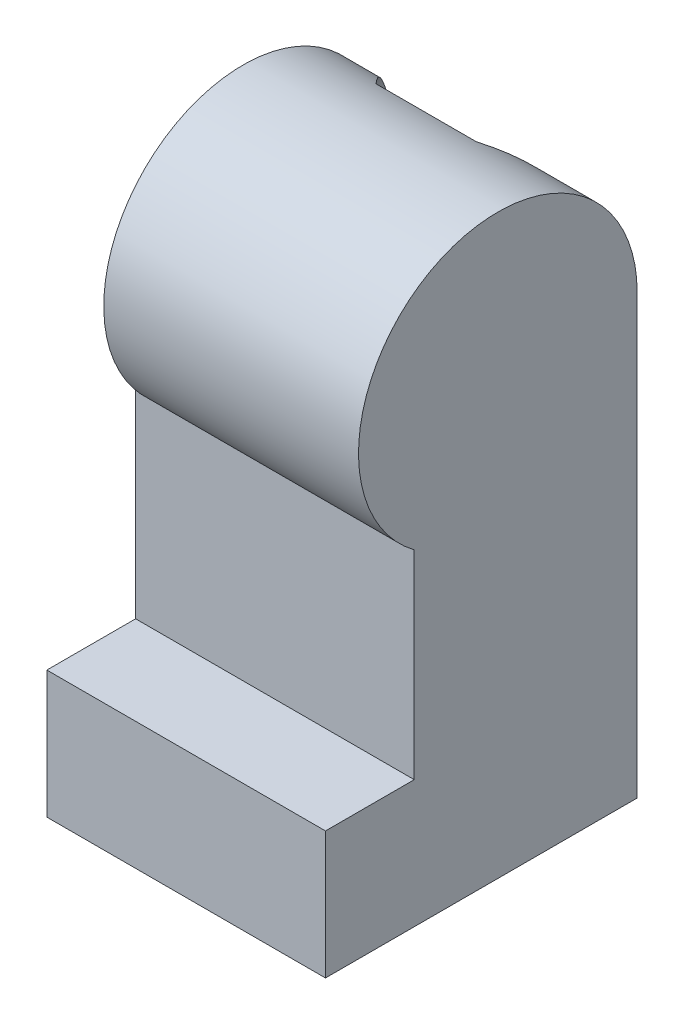
ISO-10303-21;
HEADER;
FILE_DESCRIPTION(('STEP AP214'),'2;1');
FILE_NAME('part.step','',(''),(''),'','','');
FILE_SCHEMA(('AUTOMOTIVE_DESIGN { 1 0 10303 214 1 1 1 1 }'));
ENDSEC;
DATA;
#1=APPLICATION_CONTEXT('core data for automotive mechanical design processes');
#2=APPLICATION_PROTOCOL_DEFINITION('international standard','automotive_design',2000,#1);
#3=PRODUCT_CONTEXT('',#1,'mechanical');
#4=PRODUCT('Part','Part','',(#3));
#5=PRODUCT_RELATED_PRODUCT_CATEGORY('part','',(#4));
#6=PRODUCT_DEFINITION_FORMATION('','',#4);
#7=PRODUCT_DEFINITION_CONTEXT('part definition',#1,'design');
#8=PRODUCT_DEFINITION('design','',#6,#7);
#9=PRODUCT_DEFINITION_SHAPE('','',#8);
#10=(LENGTH_UNIT() NAMED_UNIT(*) SI_UNIT(.MILLI.,.METRE.));
#11=(NAMED_UNIT(*) PLANE_ANGLE_UNIT() SI_UNIT($,.RADIAN.));
#12=(NAMED_UNIT(*) SI_UNIT($,.STERADIAN.) SOLID_ANGLE_UNIT());
#13=UNCERTAINTY_MEASURE_WITH_UNIT(LENGTH_MEASURE(1.E-05),#10,'distance_accuracy_value','');
#14=(GEOMETRIC_REPRESENTATION_CONTEXT(3) GLOBAL_UNCERTAINTY_ASSIGNED_CONTEXT((#13)) GLOBAL_UNIT_ASSIGNED_CONTEXT((#10,
#11,#12)) REPRESENTATION_CONTEXT('',''));
#15=CARTESIAN_POINT('',(0.,0.,0.));
#16=DIRECTION('',(0.,0.,1.));
#17=DIRECTION('',(1.,0.,0.));
#18=AXIS2_PLACEMENT_3D('',#15,#16,#17);
#19=CARTESIAN_POINT('',(10.5,11.9,-6.03));
#20=DIRECTION('',(0.,0.,-1.));
#21=DIRECTION('',(1.,0.,0.));
#22=AXIS2_PLACEMENT_3D('',#19,#20,#21);
#23=PLANE('',#22);
#24=DIRECTION('',(0.,1.,0.));
#25=VECTOR('',#24,1.);
#26=CARTESIAN_POINT('',(12.659602312779,13.1594117081557,-6.03));
#27=LINE('',#26,#25);
#28=CARTESIAN_POINT('',(12.659602312779,10.6405882918443,-6.03));
#29=VERTEX_POINT('',#28);
#30=CARTESIAN_POINT('',(12.659602312779,13.1594117081557,-6.03));
#31=VERTEX_POINT('',#30);
#32=EDGE_CURVE('E187',#29,#31,#27,.T.);
#33=ORIENTED_EDGE('',*,*,#32,.T.);
#34=CARTESIAN_POINT('',(10.5,11.9,-6.03));
#35=DIRECTION('',(0.,0.,1.));
#36=DIRECTION('',(1.,0.,0.));
#37=AXIS2_PLACEMENT_3D('',#34,#35,#36);
#38=CIRCLE('',#37,2.5);
#39=EDGE_CURVE('E267',#29,#31,#38,.T.);
#40=ORIENTED_EDGE('',*,*,#39,.F.);
#41=EDGE_LOOP('',(#33,#40));
#42=FACE_BOUND('',#41,.T.);
#43=ADVANCED_FACE('F39',(#42),#23,.T.);
#44=CARTESIAN_POINT('',(7.,11.,-4.33));
#45=DIRECTION('',(1.,0.,0.));
#46=DIRECTION('',(0.,0.,1.));
#47=AXIS2_PLACEMENT_3D('',#44,#45,#46);
#48=CYLINDRICAL_SURFACE('',#47,3.5);
#49=DIRECTION('',(1.,0.,0.));
#50=VECTOR('',#49,1.);
#51=CARTESIAN_POINT('',(7.,11.,-7.83));
#52=LINE('',#51,#50);
#53=CARTESIAN_POINT('',(7.6,11.,-7.83));
#54=VERTEX_POINT('',#53);
#55=CARTESIAN_POINT('',(8.16761924206188,11.,-7.83));
#56=VERTEX_POINT('',#55);
#57=EDGE_CURVE('E399',#54,#56,#52,.T.);
#58=ORIENTED_EDGE('',*,*,#57,.F.);
#59=CARTESIAN_POINT('',(7.6,11.,-4.33));
#60=DIRECTION('',(1.,0.,0.));
#61=DIRECTION('',(0.,0.,-1.));
#62=AXIS2_PLACEMENT_3D('',#59,#60,#61);
#63=CIRCLE('',#62,3.5);
#64=CARTESIAN_POINT('',(7.6,8.2,-2.23));
#65=VERTEX_POINT('',#64);
#66=EDGE_CURVE('E446',#54,#65,#63,.T.);
#67=ORIENTED_EDGE('',*,*,#66,.T.);
#68=DIRECTION('',(1.,0.,0.));
#69=VECTOR('',#68,1.);
#70=CARTESIAN_POINT('',(7.,8.2,-2.23));
#71=LINE('',#70,#69);
#72=CARTESIAN_POINT('',(14.,8.2,-2.23));
#73=VERTEX_POINT('',#72);
#74=EDGE_CURVE('E409',#65,#73,#71,.T.);
#75=ORIENTED_EDGE('',*,*,#74,.T.);
#76=CARTESIAN_POINT('',(14.,11.,-4.33));
#77=DIRECTION('',(1.,0.,0.));
#78=DIRECTION('',(0.,0.,1.));
#79=AXIS2_PLACEMENT_3D('',#76,#77,#78);
#80=CIRCLE('',#79,3.5);
#81=CARTESIAN_POINT('',(14.,11.,-7.83));
#82=VERTEX_POINT('',#81);
#83=EDGE_CURVE('E405',#82,#73,#80,.T.);
#84=ORIENTED_EDGE('',*,*,#83,.F.);
#85=CARTESIAN_POINT('',(12.8323807579381,11.,-7.83));
#86=VERTEX_POINT('',#85);
#87=EDGE_CURVE('E392',#86,#82,#52,.T.);
#88=ORIENTED_EDGE('',*,*,#87,.F.);
#89=CARTESIAN_POINT('',(11.7597384945616,14.0594117081557,-6.03));
#90=CARTESIAN_POINT('',(11.8269170363958,14.0201847934842,-6.10060872018845));
#91=CARTESIAN_POINT('',(11.8924138425216,13.9778062067549,-6.17110437893786));
#92=CARTESIAN_POINT('',(12.0199070438475,13.886475673501,-6.31122449351207));
#93=CARTESIAN_POINT('',(12.0818980752608,13.8375140219315,-6.38084749392807));
#94=CARTESIAN_POINT('',(12.2026603057797,13.7323237192715,-6.51907095077589));
#95=CARTESIAN_POINT('',(12.2613917290616,13.6760253638337,-6.58765346961922));
#96=CARTESIAN_POINT('',(12.3743275687795,13.5564001910063,-6.72226296218016));
#97=CARTESIAN_POINT('',(12.4285347644146,13.4930777449861,-6.78829149121666));
#98=CARTESIAN_POINT('',(12.5579800485929,13.3251253424091,-6.9498129946883));
#99=CARTESIAN_POINT('',(12.629913797011,13.215851810845,-7.0432353067989));
#100=CARTESIAN_POINT('',(12.7581230005923,12.9810490235027,-7.21908778885267));
#101=CARTESIAN_POINT('',(12.8144565088714,12.8555826543195,-7.30155810113673));
#102=CARTESIAN_POINT('',(12.8987130416593,12.6137561391326,-7.43828234742055));
#103=CARTESIAN_POINT('',(12.929946153069,12.49991962628,-7.49493864656214));
#104=CARTESIAN_POINT('',(12.9763091085754,12.263750084517,-7.59640100657131));
#105=CARTESIAN_POINT('',(12.9914393811044,12.1414172817513,-7.64120738269428));
#106=CARTESIAN_POINT('',(13.0002185014562,11.9537837363267,-7.69818210216271));
#107=CARTESIAN_POINT('',(13.0007994518895,11.8902869949017,-7.71551654467827));
#108=CARTESIAN_POINT('',(12.9970348332925,11.7625652319258,-7.74654781322381));
#109=CARTESIAN_POINT('',(12.9926916438571,11.6983405769829,-7.76024639234143));
#110=CARTESIAN_POINT('',(12.9789416670705,11.5698114935737,-7.78392315250354));
#111=CARTESIAN_POINT('',(12.9695394045106,11.5055071875433,-7.79390464460064));
#112=CARTESIAN_POINT('',(12.9456374275569,11.3774122743731,-7.81019020121197));
#113=CARTESIAN_POINT('',(12.9311406114651,11.3136213962056,-7.8164963512245));
#114=CARTESIAN_POINT('',(12.9027218090513,11.2080053885378,-7.82407239011788));
#115=CARTESIAN_POINT('',(12.8901847199492,11.1658691875481,-7.82631710407692));
#116=CARTESIAN_POINT('',(12.8629174636449,11.0823513081066,-7.82928055361981));
#117=CARTESIAN_POINT('',(12.8481917507054,11.0409682844664,-7.83000234432515));
#118=CARTESIAN_POINT('',(12.8323807579381,11.,-7.83));
#119=B_SPLINE_CURVE_WITH_KNOTS('',3,(#89,#90,#91,#92,#93,#94,#95,#96,#97,#98,#99,#100,#101,#102,
#103,#104,#105,#106,#107,#108,#109,#110,#111,#112,#113,#114,#115,#116,#117,#118),.UNSPECIFIED.,
.F.,.F.,(4,2,2,2,2,2,2,2,2,2,2,2,2,2,4),(0.,0.315151563393052,0.630772938407095,
0.949647664416301,1.26832504380493,1.74888218158112,2.2276262284512,2.61891205471195,
3.01018747015603,3.20741415078802,3.40454556206459,3.60150095306902,3.79834447665022,
3.9303197138308,4.06202994406064),.UNSPECIFIED.);
#120=CARTESIAN_POINT('',(11.7597384945616,14.0594117081557,-6.03));
#121=VERTEX_POINT('',#120);
#122=EDGE_CURVE('E264',#121,#86,#119,.T.);
#123=ORIENTED_EDGE('',*,*,#122,.F.);
#124=DIRECTION('',(1.,0.,0.));
#125=VECTOR('',#124,1.);
#126=CARTESIAN_POINT('',(7.,14.0594117081557,-6.03));
#127=LINE('',#126,#125);
#128=CARTESIAN_POINT('',(9.24026150543844,14.0594117081557,-6.03));
#129=VERTEX_POINT('',#128);
#130=EDGE_CURVE('E47',#121,#129,#127,.F.);
#131=ORIENTED_EDGE('',*,*,#130,.T.);
#132=CARTESIAN_POINT('',(8.16761924206188,11.,-7.83));
#133=CARTESIAN_POINT('',(8.14615177989283,11.0556037228795,-7.83001039992839));
#134=CARTESIAN_POINT('',(8.12669136325152,11.1119864470982,-7.82867511545479));
#135=CARTESIAN_POINT('',(8.09187280917411,11.2258673812913,-7.82316690174125));
#136=CARTESIAN_POINT('',(8.0765146266199,11.2833655789899,-7.81899400371236));
#137=CARTESIAN_POINT('',(8.05004337555136,11.398795817994,-7.80768783715019));
#138=CARTESIAN_POINT('',(8.03891292930839,11.4567250630494,-7.80056694421528));
#139=CARTESIAN_POINT('',(8.02081235353894,11.5727648991559,-7.78331566720582));
#140=CARTESIAN_POINT('',(8.01384194622392,11.6308754778378,-7.77318548414569));
#141=CARTESIAN_POINT('',(7.99910835882942,11.8048723986325,-7.73824257253206));
#142=CARTESIAN_POINT('',(7.99751647081468,11.9204521126609,-7.70887479252964));
#143=CARTESIAN_POINT('',(8.00965198142615,12.1471916349346,-7.63878917767626));
#144=CARTESIAN_POINT('',(8.02338624827262,12.2583494384298,-7.59806626030262));
#145=CARTESIAN_POINT('',(8.06486402925899,12.4769175354432,-7.50540527907961));
#146=CARTESIAN_POINT('',(8.09299494351911,12.5841312762403,-7.45318113676706));
#147=CARTESIAN_POINT('',(8.16118714895019,12.7897849945176,-7.34006344052072));
#148=CARTESIAN_POINT('',(8.20125622019924,12.8882191958614,-7.2791642466183));
#149=CARTESIAN_POINT('',(8.31511676823279,13.1254072001919,-7.11620266989741));
#150=CARTESIAN_POINT('',(8.39551340098805,13.2577904960523,-7.00946321174239));
#151=CARTESIAN_POINT('',(8.57329011604992,13.5001573524239,-6.78492408509301));
#152=CARTESIAN_POINT('',(8.67071979837661,13.6100734029028,-6.66709259247695));
#153=CARTESIAN_POINT('',(8.84668508222913,13.7778882147941,-6.46193011620579));
#154=CARTESIAN_POINT('',(8.92190568254684,13.8414219972976,-6.3762723496963));
#155=CARTESIAN_POINT('',(9.03859410206556,13.9289491749926,-6.24675438405102));
#156=CARTESIAN_POINT('',(9.07798877112856,13.9567455338021,-6.20356263672901));
#157=CARTESIAN_POINT('',(9.15812093316136,14.0098970517849,-6.11692589064731));
#158=CARTESIAN_POINT('',(9.19885838282646,14.0352522895812,-6.07348090009182));
#159=CARTESIAN_POINT('',(9.24026150543844,14.0594117081557,-6.03));
#160=B_SPLINE_CURVE_WITH_KNOTS('',3,(#132,#133,#134,#135,#136,#137,#138,#139,#140,#141,#142,
#143,#144,#145,#146,#147,#148,#149,#150,#151,#152,#153,#154,#155,#156,#157,#158,#159),
.UNSPECIFIED.,.F.,.F.,(4,2,2,2,2,2,2,2,2,2,2,2,2,4),(0.,0.178763199102519,0.357524432010829,
0.535542719933675,0.71354911927172,1.06947602744379,1.42556250378531,1.79177839089952,
2.15823346432115,2.71942223368447,3.28227325770834,3.6732563436139,3.867394978456,
4.06152735843827),.UNSPECIFIED.);
#161=EDGE_CURVE('E278',#56,#129,#160,.T.);
#162=ORIENTED_EDGE('',*,*,#161,.F.);
#163=EDGE_LOOP('',(#58,#67,#75,#84,#88,#123,#131,#162));
#164=FACE_BOUND('',#163,.T.);
#165=ADVANCED_FACE('F288',(#164),#48,.T.);
#166=CARTESIAN_POINT('',(7.,3.2,0.));
#167=DIRECTION('',(0.,0.,-1.));
#168=DIRECTION('',(0.,1.,0.));
#169=AXIS2_PLACEMENT_3D('',#166,#167,#168);
#170=PLANE('',#169);
#171=DIRECTION('',(0.,-1.,0.));
#172=VECTOR('',#171,1.);
#173=CARTESIAN_POINT('',(14.,3.2,0.));
#174=LINE('',#173,#172);
#175=CARTESIAN_POINT('',(14.,3.2,0.));
#176=VERTEX_POINT('',#175);
#177=CARTESIAN_POINT('',(14.,0.,0.));
#178=VERTEX_POINT('',#177);
#179=EDGE_CURVE('E449',#176,#178,#174,.T.);
#180=ORIENTED_EDGE('',*,*,#179,.F.);
#181=DIRECTION('',(1.,0.,0.));
#182=VECTOR('',#181,1.);
#183=CARTESIAN_POINT('',(7.,3.2,0.));
#184=LINE('',#183,#182);
#185=CARTESIAN_POINT('',(7.,3.2,0.));
#186=VERTEX_POINT('',#185);
#187=EDGE_CURVE('E422',#186,#176,#184,.T.);
#188=ORIENTED_EDGE('',*,*,#187,.F.);
#189=DIRECTION('',(0.,-1.,0.));
#190=VECTOR('',#189,1.);
#191=CARTESIAN_POINT('',(7.,3.2,0.));
#192=LINE('',#191,#190);
#193=CARTESIAN_POINT('',(7.,0.,0.));
#194=VERTEX_POINT('',#193);
#195=EDGE_CURVE('E421',#186,#194,#192,.T.);
#196=ORIENTED_EDGE('',*,*,#195,.T.);
#197=DIRECTION('',(1.,0.,0.));
#198=VECTOR('',#197,1.);
#199=CARTESIAN_POINT('',(7.,0.,0.));
#200=LINE('',#199,#198);
#201=EDGE_CURVE('E434',#194,#178,#200,.T.);
#202=ORIENTED_EDGE('',*,*,#201,.T.);
#203=EDGE_LOOP('',(#180,#188,#196,#202));
#204=FACE_BOUND('',#203,.T.);
#205=ADVANCED_FACE('F41',(#204),#170,.F.);
#206=CARTESIAN_POINT('',(7.,0.,0.));
#207=DIRECTION('',(0.,1.,0.));
#208=DIRECTION('',(0.,0.,1.));
#209=AXIS2_PLACEMENT_3D('',#206,#207,#208);
#210=PLANE('',#209);
#211=DIRECTION('',(-1.,0.,0.));
#212=VECTOR('',#211,1.);
#213=CARTESIAN_POINT('',(8.,0.,-6.4));
#214=LINE('',#213,#212);
#215=CARTESIAN_POINT('',(13.,0.,-6.4));
#216=VERTEX_POINT('',#215);
#217=CARTESIAN_POINT('',(8.,0.,-6.4));
#218=VERTEX_POINT('',#217);
#219=EDGE_CURVE('E245',#216,#218,#214,.T.);
#220=ORIENTED_EDGE('',*,*,#219,.T.);
#221=DIRECTION('',(0.,0.,1.));
#222=VECTOR('',#221,1.);
#223=CARTESIAN_POINT('',(8.,0.,-1.4));
#224=LINE('',#223,#222);
#225=CARTESIAN_POINT('',(8.,0.,-1.4));
#226=VERTEX_POINT('',#225);
#227=EDGE_CURVE('E248',#218,#226,#224,.T.);
#228=ORIENTED_EDGE('',*,*,#227,.T.);
#229=DIRECTION('',(1.,0.,0.));
#230=VECTOR('',#229,1.);
#231=CARTESIAN_POINT('',(13.,0.,-1.4));
#232=LINE('',#231,#230);
#233=CARTESIAN_POINT('',(13.,0.,-1.4));
#234=VERTEX_POINT('',#233);
#235=EDGE_CURVE('E238',#226,#234,#232,.T.);
#236=ORIENTED_EDGE('',*,*,#235,.T.);
#237=DIRECTION('',(0.,0.,-1.));
#238=VECTOR('',#237,1.);
#239=CARTESIAN_POINT('',(13.,0.,-6.4));
#240=LINE('',#239,#238);
#241=EDGE_CURVE('E233',#234,#216,#240,.T.);
#242=ORIENTED_EDGE('',*,*,#241,.T.);
#243=EDGE_LOOP('',(#220,#228,#236,#242));
#244=FACE_BOUND('',#243,.T.);
#245=DIRECTION('',(0.,0.,-1.));
#246=VECTOR('',#245,1.);
#247=CARTESIAN_POINT('',(14.,0.,0.));
#248=LINE('',#247,#246);
#249=CARTESIAN_POINT('',(14.,0.,-7.83));
#250=VERTEX_POINT('',#249);
#251=EDGE_CURVE('E416',#178,#250,#248,.T.);
#252=ORIENTED_EDGE('',*,*,#251,.F.);
#253=ORIENTED_EDGE('',*,*,#201,.F.);
#254=DIRECTION('',(0.,0.,-1.));
#255=VECTOR('',#254,1.);
#256=CARTESIAN_POINT('',(7.,0.,0.));
#257=LINE('',#256,#255);
#258=CARTESIAN_POINT('',(7.,0.,-7.83));
#259=VERTEX_POINT('',#258);
#260=EDGE_CURVE('E452',#194,#259,#257,.T.);
#261=ORIENTED_EDGE('',*,*,#260,.T.);
#262=DIRECTION('',(1.,0.,0.));
#263=VECTOR('',#262,1.);
#264=CARTESIAN_POINT('',(7.,0.,-7.83));
#265=LINE('',#264,#263);
#266=EDGE_CURVE('E432',#259,#250,#265,.T.);
#267=ORIENTED_EDGE('',*,*,#266,.T.);
#268=EDGE_LOOP('',(#252,#253,#261,#267));
#269=FACE_BOUND('',#268,.T.);
#270=ADVANCED_FACE('F299',(#244,#269),#210,.F.);
#271=CARTESIAN_POINT('',(7.,0.,-7.83));
#272=DIRECTION('',(0.,0.,1.));
#273=DIRECTION('',(-1.,0.,0.));
#274=AXIS2_PLACEMENT_3D('',#271,#272,#273);
#275=PLANE('',#274);
#276=CARTESIAN_POINT('',(10.5,3.9,-7.83));
#277=DIRECTION('',(0.,0.,1.));
#278=DIRECTION('',(1.,0.,0.));
#279=AXIS2_PLACEMENT_3D('',#276,#277,#278);
#280=CIRCLE('',#279,2.5);
#281=CARTESIAN_POINT('',(13.,3.9,-7.83));
#282=VERTEX_POINT('',#281);
#283=EDGE_CURVE('E261',#282,#282,#280,.T.);
#284=ORIENTED_EDGE('',*,*,#283,.T.);
#285=EDGE_LOOP('',(#284));
#286=FACE_BOUND('',#285,.T.);
#287=ORIENTED_EDGE('',*,*,#87,.T.);
#288=DIRECTION('',(0.,1.,0.));
#289=VECTOR('',#288,1.);
#290=CARTESIAN_POINT('',(14.,0.,-7.83));
#291=LINE('',#290,#289);
#292=EDGE_CURVE('E395',#250,#82,#291,.T.);
#293=ORIENTED_EDGE('',*,*,#292,.F.);
#294=ORIENTED_EDGE('',*,*,#266,.F.);
#295=DIRECTION('',(0.,1.,0.));
#296=VECTOR('',#295,1.);
#297=CARTESIAN_POINT('',(7.,0.,-7.83));
#298=LINE('',#297,#296);
#299=CARTESIAN_POINT('',(7.,11.,-7.83));
#300=VERTEX_POINT('',#299);
#301=EDGE_CURVE('E455',#259,#300,#298,.T.);
#302=ORIENTED_EDGE('',*,*,#301,.T.);
#303=EDGE_CURVE('E402',#300,#54,#52,.T.);
#304=ORIENTED_EDGE('',*,*,#303,.T.);
#305=ORIENTED_EDGE('',*,*,#57,.T.);
#306=CARTESIAN_POINT('',(10.5,11.9,-7.83));
#307=DIRECTION('',(0.,0.,1.));
#308=DIRECTION('',(1.,0.,0.));
#309=AXIS2_PLACEMENT_3D('',#306,#307,#308);
#310=CIRCLE('',#309,2.5);
#311=EDGE_CURVE('E255',#56,#86,#310,.T.);
#312=ORIENTED_EDGE('',*,*,#311,.T.);
#313=EDGE_LOOP('',(#287,#293,#294,#302,#304,#305,#312));
#314=FACE_BOUND('',#313,.T.);
#315=ADVANCED_FACE('F296',(#286,#314),#275,.F.);
#316=CARTESIAN_POINT('',(7.,3.2,-2.23));
#317=DIRECTION('',(0.,0.,-1.));
#318=DIRECTION('',(1.,0.,0.));
#319=AXIS2_PLACEMENT_3D('',#316,#317,#318);
#320=PLANE('',#319);
#321=DIRECTION('',(0.,-1.,0.));
#322=VECTOR('',#321,1.);
#323=CARTESIAN_POINT('',(14.,3.2,-2.23));
#324=LINE('',#323,#322);
#325=CARTESIAN_POINT('',(14.,3.2,-2.23));
#326=VERTEX_POINT('',#325);
#327=EDGE_CURVE('E412',#73,#326,#324,.T.);
#328=ORIENTED_EDGE('',*,*,#327,.F.);
#329=ORIENTED_EDGE('',*,*,#74,.F.);
#330=CARTESIAN_POINT('',(7.,8.2,-2.23));
#331=VERTEX_POINT('',#330);
#332=EDGE_CURVE('E400',#331,#65,#71,.T.);
#333=ORIENTED_EDGE('',*,*,#332,.F.);
#334=DIRECTION('',(0.,-1.,0.));
#335=VECTOR('',#334,1.);
#336=CARTESIAN_POINT('',(7.,3.2,-2.23));
#337=LINE('',#336,#335);
#338=CARTESIAN_POINT('',(7.,3.2,-2.23));
#339=VERTEX_POINT('',#338);
#340=EDGE_CURVE('E458',#331,#339,#337,.T.);
#341=ORIENTED_EDGE('',*,*,#340,.T.);
#342=DIRECTION('',(1.,0.,0.));
#343=VECTOR('',#342,1.);
#344=CARTESIAN_POINT('',(7.,3.2,-2.23));
#345=LINE('',#344,#343);
#346=EDGE_CURVE('E425',#339,#326,#345,.T.);
#347=ORIENTED_EDGE('',*,*,#346,.T.);
#348=EDGE_LOOP('',(#328,#329,#333,#341,#347));
#349=FACE_BOUND('',#348,.T.);
#350=ADVANCED_FACE('F294',(#349),#320,.F.);
#351=CARTESIAN_POINT('',(7.,3.2,-2.23));
#352=DIRECTION('',(0.,-1.,0.));
#353=DIRECTION('',(0.,0.,-1.));
#354=AXIS2_PLACEMENT_3D('',#351,#352,#353);
#355=PLANE('',#354);
#356=DIRECTION('',(0.,0.,1.));
#357=VECTOR('',#356,1.);
#358=CARTESIAN_POINT('',(14.,3.2,-2.23));
#359=LINE('',#358,#357);
#360=EDGE_CURVE('E414',#326,#176,#359,.T.);
#361=ORIENTED_EDGE('',*,*,#360,.F.);
#362=ORIENTED_EDGE('',*,*,#346,.F.);
#363=DIRECTION('',(0.,0.,1.));
#364=VECTOR('',#363,1.);
#365=CARTESIAN_POINT('',(7.,3.2,-2.23));
#366=LINE('',#365,#364);
#367=EDGE_CURVE('E426',#339,#186,#366,.T.);
#368=ORIENTED_EDGE('',*,*,#367,.T.);
#369=ORIENTED_EDGE('',*,*,#187,.T.);
#370=EDGE_LOOP('',(#361,#362,#368,#369));
#371=FACE_BOUND('',#370,.T.);
#372=ADVANCED_FACE('F481',(#371),#355,.F.);
#373=CARTESIAN_POINT('',(7.,11.,-4.33));
#374=DIRECTION('',(1.,0.,0.));
#375=DIRECTION('',(0.,0.,1.));
#376=AXIS2_PLACEMENT_3D('',#373,#374,#375);
#377=PLANE('',#376);
#378=ORIENTED_EDGE('',*,*,#301,.F.);
#379=ORIENTED_EDGE('',*,*,#260,.F.);
#380=ORIENTED_EDGE('',*,*,#195,.F.);
#381=ORIENTED_EDGE('',*,*,#367,.F.);
#382=ORIENTED_EDGE('',*,*,#340,.F.);
#383=CARTESIAN_POINT('',(7.,11.,-4.33));
#384=DIRECTION('',(-1.,0.,0.));
#385=DIRECTION('',(0.,0.,1.));
#386=AXIS2_PLACEMENT_3D('',#383,#384,#385);
#387=CIRCLE('',#386,3.5);
#388=EDGE_CURVE('E437',#300,#331,#387,.T.);
#389=ORIENTED_EDGE('',*,*,#388,.F.);
#390=EDGE_LOOP('',(#378,#379,#380,#381,#382,#389));
#391=FACE_BOUND('',#390,.T.);
#392=ADVANCED_FACE('F470',(#391),#377,.F.);
#393=CARTESIAN_POINT('',(14.,11.,-4.33));
#394=DIRECTION('',(1.,0.,0.));
#395=DIRECTION('',(0.,0.,1.));
#396=AXIS2_PLACEMENT_3D('',#393,#394,#395);
#397=PLANE('',#396);
#398=ORIENTED_EDGE('',*,*,#179,.T.);
#399=ORIENTED_EDGE('',*,*,#251,.T.);
#400=ORIENTED_EDGE('',*,*,#292,.T.);
#401=ORIENTED_EDGE('',*,*,#83,.T.);
#402=ORIENTED_EDGE('',*,*,#327,.T.);
#403=ORIENTED_EDGE('',*,*,#360,.T.);
#404=EDGE_LOOP('',(#398,#399,#400,#401,#402,#403));
#405=FACE_BOUND('',#404,.T.);
#406=ADVANCED_FACE('F464',(#405),#397,.T.);
#407=CARTESIAN_POINT('',(7.6,11.,-4.33));
#408=DIRECTION('',(-1.,0.,0.));
#409=DIRECTION('',(0.,0.,-1.));
#410=AXIS2_PLACEMENT_3D('',#407,#408,#409);
#411=CYLINDRICAL_SURFACE('',#410,3.5);
#412=EDGE_CURVE('E443',#65,#54,#63,.T.);
#413=ORIENTED_EDGE('',*,*,#412,.T.);
#414=ORIENTED_EDGE('',*,*,#303,.F.);
#415=ORIENTED_EDGE('',*,*,#388,.T.);
#416=ORIENTED_EDGE('',*,*,#332,.T.);
#417=EDGE_LOOP('',(#413,#414,#415,#416));
#418=FACE_BOUND('',#417,.T.);
#419=ADVANCED_FACE('F478',(#418),#411,.F.);
#420=CARTESIAN_POINT('',(7.6,11.,-4.33));
#421=DIRECTION('',(-1.,0.,0.));
#422=DIRECTION('',(0.,0.,-1.));
#423=AXIS2_PLACEMENT_3D('',#420,#421,#422);
#424=PLANE('',#423);
#425=CARTESIAN_POINT('',(7.6,11.,-4.33));
#426=DIRECTION('',(1.,0.,0.));
#427=DIRECTION('',(0.,0.,-1.));
#428=AXIS2_PLACEMENT_3D('',#425,#426,#427);
#429=CIRCLE('',#428,1.125);
#430=CARTESIAN_POINT('',(7.6,11.,-5.455));
#431=VERTEX_POINT('',#430);
#432=EDGE_CURVE('E441',#431,#431,#429,.T.);
#433=ORIENTED_EDGE('',*,*,#432,.T.);
#434=EDGE_LOOP('',(#433));
#435=FACE_BOUND('',#434,.T.);
#436=ORIENTED_EDGE('',*,*,#66,.F.);
#437=ORIENTED_EDGE('',*,*,#412,.F.);
#438=EDGE_LOOP('',(#436,#437));
#439=FACE_BOUND('',#438,.T.);
#440=ADVANCED_FACE('F324',(#435,#439),#424,.T.);
#441=CARTESIAN_POINT('',(11.6,11.,-4.33));
#442=DIRECTION('',(-1.,0.,0.));
#443=DIRECTION('',(0.,0.,-1.));
#444=AXIS2_PLACEMENT_3D('',#441,#442,#443);
#445=CYLINDRICAL_SURFACE('',#444,1.125);
#446=CARTESIAN_POINT('',(9.6,11.,-4.33));
#447=DIRECTION('',(1.,0.,0.));
#448=DIRECTION('',(0.,1.,0.));
#449=AXIS2_PLACEMENT_3D('',#446,#447,#448);
#450=CIRCLE('',#449,1.125);
#451=CARTESIAN_POINT('',(9.6,12.125,-4.33));
#452=VERTEX_POINT('',#451);
#453=EDGE_CURVE('E206',#452,#452,#450,.F.);
#454=ORIENTED_EDGE('',*,*,#453,.F.);
#455=EDGE_LOOP('',(#454));
#456=FACE_BOUND('',#455,.T.);
#457=ORIENTED_EDGE('',*,*,#432,.F.);
#458=EDGE_LOOP('',(#457));
#459=FACE_BOUND('',#458,.T.);
#460=ADVANCED_FACE('F316',(#456,#459),#445,.F.);
#461=DIRECTION('',(-1.,0.,0.));
#462=VECTOR('',#461,1.);
#463=CARTESIAN_POINT('',(9.6,13.1594117081557,-6.03));
#464=LINE('',#463,#462);
#465=CARTESIAN_POINT('',(9.6,13.1594117081557,-6.03));
#466=VERTEX_POINT('',#465);
#467=EDGE_CURVE('E327',#31,#466,#464,.T.);
#468=ORIENTED_EDGE('',*,*,#467,.T.);
#469=DIRECTION('',(0.,-1.,0.));
#470=VECTOR('',#469,1.);
#471=CARTESIAN_POINT('',(9.6,13.1594117081557,-6.03));
#472=LINE('',#471,#470);
#473=CARTESIAN_POINT('',(9.6,9.56761924206188,-6.03));
#474=VERTEX_POINT('',#473);
#475=EDGE_CURVE('E197',#466,#474,#472,.T.);
#476=ORIENTED_EDGE('',*,*,#475,.T.);
#477=EDGE_CURVE('E265',#129,#474,#38,.T.);
#478=ORIENTED_EDGE('',*,*,#477,.F.);
#479=ORIENTED_EDGE('',*,*,#130,.F.);
#480=EDGE_CURVE('E268',#31,#121,#38,.T.);
#481=ORIENTED_EDGE('',*,*,#480,.F.);
#482=EDGE_LOOP('',(#468,#476,#478,#479,#481));
#483=FACE_BOUND('',#482,.T.);
#484=ADVANCED_FACE('F310',(#483),#23,.T.);
#485=CARTESIAN_POINT('',(10.5,11.9,-6.03));
#486=DIRECTION('',(0.,0.,-1.));
#487=DIRECTION('',(1.,0.,0.));
#488=AXIS2_PLACEMENT_3D('',#485,#486,#487);
#489=CYLINDRICAL_SURFACE('',#488,2.5);
#490=ORIENTED_EDGE('',*,*,#311,.F.);
#491=ORIENTED_EDGE('',*,*,#161,.T.);
#492=ORIENTED_EDGE('',*,*,#477,.T.);
#493=DIRECTION('',(0.,0.,-1.));
#494=VECTOR('',#493,1.);
#495=CARTESIAN_POINT('',(9.6,9.56761924206188,-3.03));
#496=LINE('',#495,#494);
#497=CARTESIAN_POINT('',(9.6,9.56761924206188,-3.03));
#498=VERTEX_POINT('',#497);
#499=EDGE_CURVE('E54',#498,#474,#496,.T.);
#500=ORIENTED_EDGE('',*,*,#499,.F.);
#501=CARTESIAN_POINT('',(10.5,11.9,-3.03));
#502=DIRECTION('',(0.,0.,1.));
#503=DIRECTION('',(-1.,0.,0.));
#504=AXIS2_PLACEMENT_3D('',#501,#502,#503);
#505=CIRCLE('',#504,2.50000000000001);
#506=CARTESIAN_POINT('',(12.659602312779,10.6405882918443,-3.03));
#507=VERTEX_POINT('',#506);
#508=EDGE_CURVE('E192',#498,#507,#505,.T.);
#509=ORIENTED_EDGE('',*,*,#508,.T.);
#510=DIRECTION('',(0.,0.,-1.));
#511=VECTOR('',#510,1.);
#512=CARTESIAN_POINT('',(12.659602312779,10.6405882918443,-3.03));
#513=LINE('',#512,#511);
#514=EDGE_CURVE('E201',#507,#29,#513,.T.);
#515=ORIENTED_EDGE('',*,*,#514,.T.);
#516=ORIENTED_EDGE('',*,*,#39,.T.);
#517=ORIENTED_EDGE('',*,*,#480,.T.);
#518=ORIENTED_EDGE('',*,*,#122,.T.);
#519=EDGE_LOOP('',(#490,#491,#492,#500,#509,#515,#516,#517,#518));
#520=FACE_BOUND('',#519,.T.);
#521=ADVANCED_FACE('F284',(#520),#489,.F.);
#522=CARTESIAN_POINT('',(10.5,3.9,-6.03));
#523=DIRECTION('',(0.,0.,-1.));
#524=DIRECTION('',(1.,0.,0.));
#525=AXIS2_PLACEMENT_3D('',#522,#523,#524);
#526=CYLINDRICAL_SURFACE('',#525,2.5);
#527=CARTESIAN_POINT('',(10.5,3.9,-6.4));
#528=DIRECTION('',(0.,0.,1.));
#529=DIRECTION('',(1.,0.,0.));
#530=AXIS2_PLACEMENT_3D('',#527,#528,#529);
#531=CIRCLE('',#530,2.5);
#532=CARTESIAN_POINT('',(8.,3.9,-6.4));
#533=VERTEX_POINT('',#532);
#534=CARTESIAN_POINT('',(13.,3.9,-6.4));
#535=VERTEX_POINT('',#534);
#536=EDGE_CURVE('E222',#533,#535,#531,.F.);
#537=ORIENTED_EDGE('',*,*,#536,.F.);
#538=CARTESIAN_POINT('',(10.5,3.9,-6.4));
#539=DIRECTION('',(0.,0.,1.));
#540=DIRECTION('',(1.,0.,0.));
#541=AXIS2_PLACEMENT_3D('',#538,#539,#540);
#542=CIRCLE('',#541,2.5);
#543=EDGE_CURVE('E11',#535,#533,#542,.F.);
#544=ORIENTED_EDGE('',*,*,#543,.F.);
#545=EDGE_LOOP('',(#537,#544));
#546=FACE_BOUND('',#545,.T.);
#547=ORIENTED_EDGE('',*,*,#283,.F.);
#548=EDGE_LOOP('',(#547));
#549=FACE_BOUND('',#548,.T.);
#550=ADVANCED_FACE('F322',(#546,#549),#526,.F.);
#551=CARTESIAN_POINT('',(8.,2.2,-6.4));
#552=DIRECTION('',(0.,0.,-1.));
#553=DIRECTION('',(1.,0.,0.));
#554=AXIS2_PLACEMENT_3D('',#551,#552,#553);
#555=PLANE('',#554);
#556=ORIENTED_EDGE('',*,*,#543,.T.);
#557=DIRECTION('',(0.,-1.,0.));
#558=VECTOR('',#557,1.);
#559=CARTESIAN_POINT('',(8.,2.2,-6.4));
#560=LINE('',#559,#558);
#561=EDGE_CURVE('E258',#533,#218,#560,.T.);
#562=ORIENTED_EDGE('',*,*,#561,.T.);
#563=ORIENTED_EDGE('',*,*,#219,.F.);
#564=DIRECTION('',(0.,-1.,0.));
#565=VECTOR('',#564,1.);
#566=CARTESIAN_POINT('',(13.,2.2,-6.4));
#567=LINE('',#566,#565);
#568=EDGE_CURVE('E62',#535,#216,#567,.T.);
#569=ORIENTED_EDGE('',*,*,#568,.F.);
#570=EDGE_LOOP('',(#556,#562,#563,#569));
#571=FACE_BOUND('',#570,.T.);
#572=ADVANCED_FACE('F368',(#571),#555,.F.);
#573=CARTESIAN_POINT('',(14.,2.2,0.));
#574=DIRECTION('',(0.,1.,0.));
#575=DIRECTION('',(0.,0.,1.));
#576=AXIS2_PLACEMENT_3D('',#573,#574,#575);
#577=PLANE('',#576);
#578=DIRECTION('',(0.,0.,-1.));
#579=VECTOR('',#578,1.);
#580=CARTESIAN_POINT('',(13.,2.2,-6.4));
#581=LINE('',#580,#579);
#582=CARTESIAN_POINT('',(13.,2.2,-1.4));
#583=VERTEX_POINT('',#582);
#584=CARTESIAN_POINT('',(13.,2.2,-3.1));
#585=VERTEX_POINT('',#584);
#586=EDGE_CURVE('E234',#583,#585,#581,.T.);
#587=ORIENTED_EDGE('',*,*,#586,.F.);
#588=DIRECTION('',(1.,0.,0.));
#589=VECTOR('',#588,1.);
#590=CARTESIAN_POINT('',(13.,2.2,-1.4));
#591=LINE('',#590,#589);
#592=CARTESIAN_POINT('',(8.,2.2,-1.4));
#593=VERTEX_POINT('',#592);
#594=EDGE_CURVE('E241',#593,#583,#591,.T.);
#595=ORIENTED_EDGE('',*,*,#594,.F.);
#596=DIRECTION('',(0.,0.,1.));
#597=VECTOR('',#596,1.);
#598=CARTESIAN_POINT('',(8.,2.2,-1.4));
#599=LINE('',#598,#597);
#600=CARTESIAN_POINT('',(8.,2.2,-3.1));
#601=VERTEX_POINT('',#600);
#602=EDGE_CURVE('E237',#601,#593,#599,.T.);
#603=ORIENTED_EDGE('',*,*,#602,.F.);
#604=DIRECTION('',(-1.,0.,0.));
#605=VECTOR('',#604,1.);
#606=CARTESIAN_POINT('',(14.,2.2,-3.1));
#607=LINE('',#606,#605);
#608=EDGE_CURVE('E230',#585,#601,#607,.T.);
#609=ORIENTED_EDGE('',*,*,#608,.F.);
#610=EDGE_LOOP('',(#587,#595,#603,#609));
#611=FACE_BOUND('',#610,.T.);
#612=ADVANCED_FACE('F364',(#611),#577,.F.);
#613=CARTESIAN_POINT('',(13.,2.2,-6.4));
#614=DIRECTION('',(1.,0.,0.));
#615=DIRECTION('',(0.,0.,1.));
#616=AXIS2_PLACEMENT_3D('',#613,#614,#615);
#617=PLANE('',#616);
#618=ORIENTED_EDGE('',*,*,#241,.F.);
#619=DIRECTION('',(0.,-1.,0.));
#620=VECTOR('',#619,1.);
#621=CARTESIAN_POINT('',(13.,2.2,-1.4));
#622=LINE('',#621,#620);
#623=EDGE_CURVE('E253',#583,#234,#622,.T.);
#624=ORIENTED_EDGE('',*,*,#623,.F.);
#625=ORIENTED_EDGE('',*,*,#586,.T.);
#626=DIRECTION('',(0.,-1.,0.));
#627=VECTOR('',#626,1.);
#628=CARTESIAN_POINT('',(13.,9.,-3.1));
#629=LINE('',#628,#627);
#630=CARTESIAN_POINT('',(13.,9.,-3.1));
#631=VERTEX_POINT('',#630);
#632=EDGE_CURVE('E220',#631,#585,#629,.T.);
#633=ORIENTED_EDGE('',*,*,#632,.F.);
#634=DIRECTION('',(0.,0.,-1.));
#635=VECTOR('',#634,1.);
#636=CARTESIAN_POINT('',(13.,9.,-6.4));
#637=LINE('',#636,#635);
#638=CARTESIAN_POINT('',(13.,9.,-6.4));
#639=VERTEX_POINT('',#638);
#640=EDGE_CURVE('E209',#631,#639,#637,.T.);
#641=ORIENTED_EDGE('',*,*,#640,.T.);
#642=DIRECTION('',(0.,-1.,0.));
#643=VECTOR('',#642,1.);
#644=CARTESIAN_POINT('',(13.,9.,-6.4));
#645=LINE('',#644,#643);
#646=EDGE_CURVE('E219',#639,#535,#645,.T.);
#647=ORIENTED_EDGE('',*,*,#646,.T.);
#648=ORIENTED_EDGE('',*,*,#568,.T.);
#649=EDGE_LOOP('',(#618,#624,#625,#633,#641,#647,#648));
#650=FACE_BOUND('',#649,.T.);
#651=ADVANCED_FACE('F367',(#650),#617,.F.);
#652=CARTESIAN_POINT('',(13.,2.2,-1.4));
#653=DIRECTION('',(0.,0.,1.));
#654=DIRECTION('',(-1.,0.,0.));
#655=AXIS2_PLACEMENT_3D('',#652,#653,#654);
#656=PLANE('',#655);
#657=ORIENTED_EDGE('',*,*,#235,.F.);
#658=DIRECTION('',(0.,-1.,0.));
#659=VECTOR('',#658,1.);
#660=CARTESIAN_POINT('',(8.,2.2,-1.4));
#661=LINE('',#660,#659);
#662=EDGE_CURVE('E256',#593,#226,#661,.T.);
#663=ORIENTED_EDGE('',*,*,#662,.F.);
#664=ORIENTED_EDGE('',*,*,#594,.T.);
#665=ORIENTED_EDGE('',*,*,#623,.T.);
#666=EDGE_LOOP('',(#657,#663,#664,#665));
#667=FACE_BOUND('',#666,.T.);
#668=ADVANCED_FACE('F370',(#667),#656,.F.);
#669=CARTESIAN_POINT('',(8.,2.2,-1.4));
#670=DIRECTION('',(-1.,0.,0.));
#671=DIRECTION('',(0.,0.,-1.));
#672=AXIS2_PLACEMENT_3D('',#669,#670,#671);
#673=PLANE('',#672);
#674=ORIENTED_EDGE('',*,*,#602,.T.);
#675=ORIENTED_EDGE('',*,*,#662,.T.);
#676=ORIENTED_EDGE('',*,*,#227,.F.);
#677=ORIENTED_EDGE('',*,*,#561,.F.);
#678=DIRECTION('',(0.,-1.,0.));
#679=VECTOR('',#678,1.);
#680=CARTESIAN_POINT('',(8.,9.,-6.4));
#681=LINE('',#680,#679);
#682=CARTESIAN_POINT('',(8.,9.,-6.4));
#683=VERTEX_POINT('',#682);
#684=EDGE_CURVE('E225',#683,#533,#681,.T.);
#685=ORIENTED_EDGE('',*,*,#684,.F.);
#686=DIRECTION('',(0.,0.,1.));
#687=VECTOR('',#686,1.);
#688=CARTESIAN_POINT('',(8.,9.,-3.1));
#689=LINE('',#688,#687);
#690=CARTESIAN_POINT('',(8.,9.,-3.1));
#691=VERTEX_POINT('',#690);
#692=EDGE_CURVE('E214',#683,#691,#689,.T.);
#693=ORIENTED_EDGE('',*,*,#692,.T.);
#694=DIRECTION('',(0.,-1.,0.));
#695=VECTOR('',#694,1.);
#696=CARTESIAN_POINT('',(8.,9.,-3.1));
#697=LINE('',#696,#695);
#698=EDGE_CURVE('E223',#691,#601,#697,.T.);
#699=ORIENTED_EDGE('',*,*,#698,.T.);
#700=EDGE_LOOP('',(#674,#675,#676,#677,#685,#693,#699));
#701=FACE_BOUND('',#700,.T.);
#702=ADVANCED_FACE('F359',(#701),#673,.F.);
#703=CARTESIAN_POINT('',(13.,9.,-3.1));
#704=DIRECTION('',(0.,0.,1.));
#705=DIRECTION('',(-1.,0.,0.));
#706=AXIS2_PLACEMENT_3D('',#703,#704,#705);
#707=PLANE('',#706);
#708=ORIENTED_EDGE('',*,*,#632,.T.);
#709=ORIENTED_EDGE('',*,*,#608,.T.);
#710=ORIENTED_EDGE('',*,*,#698,.F.);
#711=DIRECTION('',(1.,0.,0.));
#712=VECTOR('',#711,1.);
#713=CARTESIAN_POINT('',(13.,9.,-3.1));
#714=LINE('',#713,#712);
#715=EDGE_CURVE('E217',#691,#631,#714,.T.);
#716=ORIENTED_EDGE('',*,*,#715,.T.);
#717=EDGE_LOOP('',(#708,#709,#710,#716));
#718=FACE_BOUND('',#717,.T.);
#719=ADVANCED_FACE('F356',(#718),#707,.F.);
#720=CARTESIAN_POINT('',(8.,9.,-6.4));
#721=DIRECTION('',(0.,0.,-1.));
#722=DIRECTION('',(1.,0.,0.));
#723=AXIS2_PLACEMENT_3D('',#720,#721,#722);
#724=PLANE('',#723);
#725=ORIENTED_EDGE('',*,*,#684,.T.);
#726=ORIENTED_EDGE('',*,*,#536,.T.);
#727=ORIENTED_EDGE('',*,*,#646,.F.);
#728=DIRECTION('',(-1.,0.,0.));
#729=VECTOR('',#728,1.);
#730=CARTESIAN_POINT('',(8.,9.,-6.4));
#731=LINE('',#730,#729);
#732=EDGE_CURVE('E212',#639,#683,#731,.T.);
#733=ORIENTED_EDGE('',*,*,#732,.T.);
#734=EDGE_LOOP('',(#725,#726,#727,#733));
#735=FACE_BOUND('',#734,.T.);
#736=ADVANCED_FACE('F354',(#735),#724,.F.);
#737=CARTESIAN_POINT('',(14.,9.,0.));
#738=DIRECTION('',(0.,1.,0.));
#739=DIRECTION('',(0.,0.,1.));
#740=AXIS2_PLACEMENT_3D('',#737,#738,#739);
#741=PLANE('',#740);
#742=ORIENTED_EDGE('',*,*,#640,.F.);
#743=ORIENTED_EDGE('',*,*,#715,.F.);
#744=ORIENTED_EDGE('',*,*,#692,.F.);
#745=ORIENTED_EDGE('',*,*,#732,.F.);
#746=EDGE_LOOP('',(#742,#743,#744,#745));
#747=FACE_BOUND('',#746,.T.);
#748=ADVANCED_FACE('F350',(#747),#741,.F.);
#749=CARTESIAN_POINT('',(9.6,13.1594117081557,-3.03));
#750=DIRECTION('',(-1.,0.,0.));
#751=DIRECTION('',(0.,1.,0.));
#752=AXIS2_PLACEMENT_3D('',#749,#750,#751);
#753=PLANE('',#752);
#754=ORIENTED_EDGE('',*,*,#475,.F.);
#755=DIRECTION('',(0.,0.,-1.));
#756=VECTOR('',#755,1.);
#757=CARTESIAN_POINT('',(9.6,13.1594117081557,-3.03));
#758=LINE('',#757,#756);
#759=CARTESIAN_POINT('',(9.6,13.1594117081557,-3.03));
#760=VERTEX_POINT('',#759);
#761=EDGE_CURVE('E183',#760,#466,#758,.T.);
#762=ORIENTED_EDGE('',*,*,#761,.F.);
#763=DIRECTION('',(0.,-1.,0.));
#764=VECTOR('',#763,1.);
#765=CARTESIAN_POINT('',(9.6,13.1594117081557,-3.03));
#766=LINE('',#765,#764);
#767=EDGE_CURVE('E186',#760,#498,#766,.T.);
#768=ORIENTED_EDGE('',*,*,#767,.T.);
#769=ORIENTED_EDGE('',*,*,#499,.T.);
#770=EDGE_LOOP('',(#754,#762,#768,#769));
#771=FACE_BOUND('',#770,.T.);
#772=ORIENTED_EDGE('',*,*,#453,.T.);
#773=EDGE_LOOP('',(#772));
#774=FACE_BOUND('',#773,.T.);
#775=ADVANCED_FACE('F194',(#771,#774),#753,.F.);
#776=CARTESIAN_POINT('',(9.6,13.1594117081557,-3.03));
#777=DIRECTION('',(0.,1.,0.));
#778=DIRECTION('',(0.,0.,1.));
#779=AXIS2_PLACEMENT_3D('',#776,#777,#778);
#780=PLANE('',#779);
#781=ORIENTED_EDGE('',*,*,#467,.F.);
#782=DIRECTION('',(0.,0.,-1.));
#783=VECTOR('',#782,1.);
#784=CARTESIAN_POINT('',(12.659602312779,13.1594117081557,-3.03));
#785=LINE('',#784,#783);
#786=CARTESIAN_POINT('',(12.659602312779,13.1594117081557,-3.03));
#787=VERTEX_POINT('',#786);
#788=EDGE_CURVE('E184',#787,#31,#785,.T.);
#789=ORIENTED_EDGE('',*,*,#788,.F.);
#790=DIRECTION('',(-1.,0.,0.));
#791=VECTOR('',#790,1.);
#792=CARTESIAN_POINT('',(9.6,13.1594117081557,-3.03));
#793=LINE('',#792,#791);
#794=EDGE_CURVE('E178',#787,#760,#793,.T.);
#795=ORIENTED_EDGE('',*,*,#794,.T.);
#796=ORIENTED_EDGE('',*,*,#761,.T.);
#797=EDGE_LOOP('',(#781,#789,#795,#796));
#798=FACE_BOUND('',#797,.T.);
#799=ADVANCED_FACE('F181',(#798),#780,.F.);
#800=CARTESIAN_POINT('',(12.659602312779,13.1594117081557,-3.03));
#801=DIRECTION('',(1.,0.,0.));
#802=DIRECTION('',(0.,0.,1.));
#803=AXIS2_PLACEMENT_3D('',#800,#801,#802);
#804=PLANE('',#803);
#805=ORIENTED_EDGE('',*,*,#32,.F.);
#806=ORIENTED_EDGE('',*,*,#514,.F.);
#807=DIRECTION('',(0.,1.,0.));
#808=VECTOR('',#807,1.);
#809=CARTESIAN_POINT('',(12.659602312779,13.1594117081557,-3.03));
#810=LINE('',#809,#808);
#811=EDGE_CURVE('E199',#507,#787,#810,.T.);
#812=ORIENTED_EDGE('',*,*,#811,.T.);
#813=ORIENTED_EDGE('',*,*,#788,.T.);
#814=EDGE_LOOP('',(#805,#806,#812,#813));
#815=FACE_BOUND('',#814,.T.);
#816=ADVANCED_FACE('F339',(#815),#804,.F.);
#817=CARTESIAN_POINT('',(10.5,11.9,-3.03));
#818=DIRECTION('',(0.,0.,1.));
#819=DIRECTION('',(-1.,0.,0.));
#820=AXIS2_PLACEMENT_3D('',#817,#818,#819);
#821=PLANE('',#820);
#822=ORIENTED_EDGE('',*,*,#794,.F.);
#823=ORIENTED_EDGE('',*,*,#811,.F.);
#824=ORIENTED_EDGE('',*,*,#508,.F.);
#825=ORIENTED_EDGE('',*,*,#767,.F.);
#826=EDGE_LOOP('',(#822,#823,#824,#825));
#827=FACE_BOUND('',#826,.T.);
#828=ADVANCED_FACE('F190',(#827),#821,.F.);
#829=CLOSED_SHELL('',(#43,#165,#205,#270,#315,#350,#372,#392,#406,#419,#440,#460,#484,#521,#550,
#572,#612,#651,#668,#702,#719,#736,#748,#775,#799,#816,#828));
#830=MANIFOLD_SOLID_BREP('B2',#829);
#831=ADVANCED_BREP_SHAPE_REPRESENTATION('',(#18,#830),#14);
#832=SHAPE_DEFINITION_REPRESENTATION(#9,#831);
ENDSEC;
END-ISO-10303-21;
